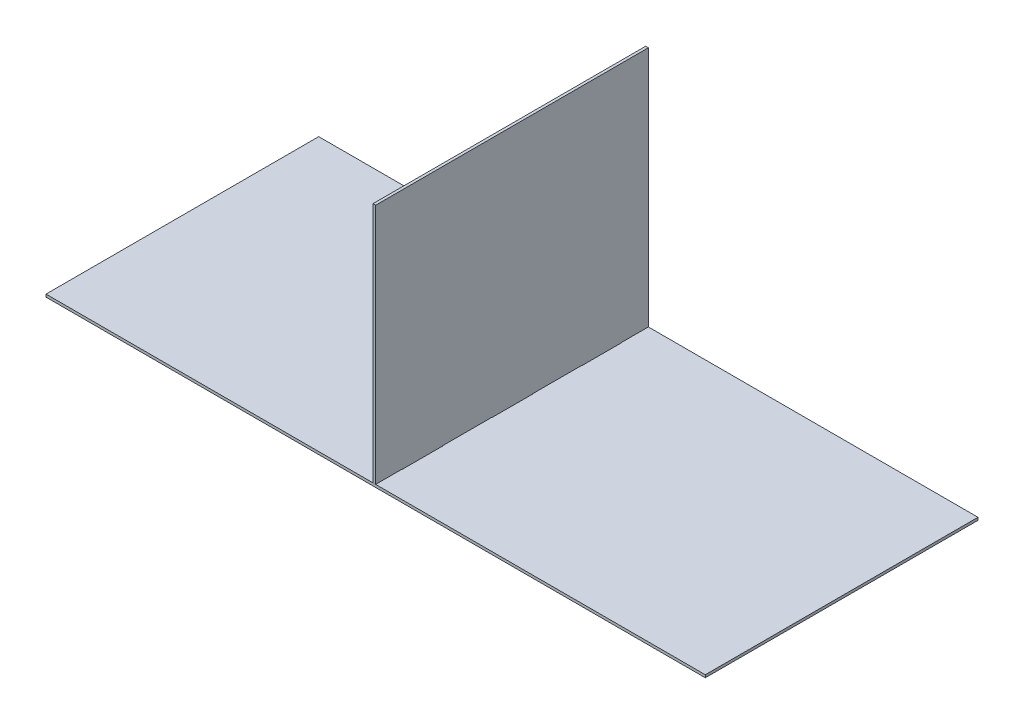
ISO-10303-21;
HEADER;
FILE_DESCRIPTION(('STEP AP214'),'2;1');
FILE_NAME('part.step','',(''),(''),'','','');
FILE_SCHEMA(('AUTOMOTIVE_DESIGN { 1 0 10303 214 1 1 1 1 }'));
ENDSEC;
DATA;
#1=APPLICATION_CONTEXT('core data for automotive mechanical design processes');
#2=APPLICATION_PROTOCOL_DEFINITION('international standard','automotive_design',2000,#1);
#3=PRODUCT_CONTEXT('',#1,'mechanical');
#4=PRODUCT('Part','Part','',(#3));
#5=PRODUCT_RELATED_PRODUCT_CATEGORY('part','',(#4));
#6=PRODUCT_DEFINITION_FORMATION('','',#4);
#7=PRODUCT_DEFINITION_CONTEXT('part definition',#1,'design');
#8=PRODUCT_DEFINITION('design','',#6,#7);
#9=PRODUCT_DEFINITION_SHAPE('','',#8);
#10=(LENGTH_UNIT() NAMED_UNIT(*) SI_UNIT(.MILLI.,.METRE.));
#11=(NAMED_UNIT(*) PLANE_ANGLE_UNIT() SI_UNIT($,.RADIAN.));
#12=(NAMED_UNIT(*) SI_UNIT($,.STERADIAN.) SOLID_ANGLE_UNIT());
#13=UNCERTAINTY_MEASURE_WITH_UNIT(LENGTH_MEASURE(1.E-05),#10,'distance_accuracy_value','');
#14=(GEOMETRIC_REPRESENTATION_CONTEXT(3) GLOBAL_UNCERTAINTY_ASSIGNED_CONTEXT((#13)) GLOBAL_UNIT_ASSIGNED_CONTEXT((#10,
#11,#12)) REPRESENTATION_CONTEXT('',''));
#15=CARTESIAN_POINT('',(0.,0.,0.));
#16=DIRECTION('',(0.,0.,1.));
#17=DIRECTION('',(1.,0.,0.));
#18=AXIS2_PLACEMENT_3D('',#15,#16,#17);
#19=CARTESIAN_POINT('',(-1.,0.,51.1200103284297));
#20=DIRECTION('',(0.,-1.,0.));
#21=DIRECTION('',(0.,0.,-1.));
#22=AXIS2_PLACEMENT_3D('',#19,#20,#21);
#23=PLANE('',#22);
#24=CARTESIAN_POINT('',(0.,0.,-26.1200103284297));
#25=CARTESIAN_POINT('',(-1.,0.,-26.1200103284297));
#26=B_SPLINE_CURVE_WITH_KNOTS('',1,(#24,#25),.UNSPECIFIED.,.F.,.F.,(2,2),(0.,0.03125),.UNSPECIFIED.);
#27=CARTESIAN_POINT('',(0.,0.,-26.1200103284297));
#28=VERTEX_POINT('',#27);
#29=CARTESIAN_POINT('',(-1.,0.,-26.1200103284297));
#30=VERTEX_POINT('',#29);
#31=EDGE_CURVE('E221',#28,#30,#26,.T.);
#32=ORIENTED_EDGE('',*,*,#31,.F.);
#33=DIRECTION('',(0.,0.,-1.));
#34=VECTOR('',#33,1.);
#35=CARTESIAN_POINT('',(0.,0.,51.1200103284297));
#36=LINE('',#35,#34);
#37=CARTESIAN_POINT('',(0.,0.,-7.49999999999999));
#38=VERTEX_POINT('',#37);
#39=EDGE_CURVE('E203',#38,#28,#36,.T.);
#40=ORIENTED_EDGE('',*,*,#39,.F.);
#41=CARTESIAN_POINT('',(-1.,0.,-7.49999999999999));
#42=CARTESIAN_POINT('',(0.,0.,-7.49999999999999));
#43=B_SPLINE_CURVE_WITH_KNOTS('',1,(#41,#42),.UNSPECIFIED.,.F.,.F.,(2,2),(0.5,0.53125),.UNSPECIFIED.);
#44=CARTESIAN_POINT('',(-1.,0.,-7.49999999999997));
#45=VERTEX_POINT('',#44);
#46=EDGE_CURVE('E257',#45,#38,#43,.T.);
#47=ORIENTED_EDGE('',*,*,#46,.F.);
#48=DIRECTION('',(0.,0.,-1.));
#49=VECTOR('',#48,1.);
#50=CARTESIAN_POINT('',(-1.,0.,51.1200103284297));
#51=LINE('',#50,#49);
#52=EDGE_CURVE('E109',#45,#30,#51,.T.);
#53=ORIENTED_EDGE('',*,*,#52,.T.);
#54=EDGE_LOOP('',(#32,#40,#47,#53));
#55=FACE_BOUND('',#54,.T.);
#56=ADVANCED_FACE('F84',(#55),#23,.T.);
#57=CARTESIAN_POINT('',(0.,0.,7.50000000000001));
#58=CARTESIAN_POINT('',(-1.,0.,7.50000000000001));
#59=B_SPLINE_CURVE_WITH_KNOTS('',1,(#57,#58),.UNSPECIFIED.,.F.,.F.,(2,2),(0.,0.03125),.UNSPECIFIED.);
#60=CARTESIAN_POINT('',(0.,0.,7.50000000000003));
#61=VERTEX_POINT('',#60);
#62=CARTESIAN_POINT('',(-1.,0.,7.50000000000003));
#63=VERTEX_POINT('',#62);
#64=EDGE_CURVE('E252',#61,#63,#59,.T.);
#65=ORIENTED_EDGE('',*,*,#64,.F.);
#66=CARTESIAN_POINT('',(0.,0.,26.1200103284297));
#67=VERTEX_POINT('',#66);
#68=EDGE_CURVE('E342',#67,#61,#36,.T.);
#69=ORIENTED_EDGE('',*,*,#68,.F.);
#70=CARTESIAN_POINT('',(-1.,0.,26.1200103284297));
#71=CARTESIAN_POINT('',(0.,0.,26.1200103284297));
#72=B_SPLINE_CURVE_WITH_KNOTS('',1,(#70,#71),.UNSPECIFIED.,.F.,.F.,(2,2),(0.5,0.53125),.UNSPECIFIED.);
#73=CARTESIAN_POINT('',(-1.,0.,26.1200103284297));
#74=VERTEX_POINT('',#73);
#75=EDGE_CURVE('E298',#74,#67,#72,.T.);
#76=ORIENTED_EDGE('',*,*,#75,.F.);
#77=EDGE_CURVE('E335',#74,#63,#51,.T.);
#78=ORIENTED_EDGE('',*,*,#77,.T.);
#79=EDGE_LOOP('',(#65,#69,#76,#78));
#80=FACE_BOUND('',#79,.T.);
#81=ADVANCED_FACE('F370',(#80),#23,.T.);
#82=CARTESIAN_POINT('',(0.,0.,41.1200103284297));
#83=CARTESIAN_POINT('',(-1.,0.,41.1200103284297));
#84=B_SPLINE_CURVE_WITH_KNOTS('',1,(#82,#83),.UNSPECIFIED.,.F.,.F.,(2,2),(0.,0.03125),.UNSPECIFIED.);
#85=CARTESIAN_POINT('',(0.,0.,41.1200103284297));
#86=VERTEX_POINT('',#85);
#87=CARTESIAN_POINT('',(-1.,0.,41.1200103284297));
#88=VERTEX_POINT('',#87);
#89=EDGE_CURVE('E251',#86,#88,#84,.T.);
#90=ORIENTED_EDGE('',*,*,#89,.F.);
#91=CARTESIAN_POINT('',(0.,0.,51.1200103284297));
#92=VERTEX_POINT('',#91);
#93=EDGE_CURVE('E206',#92,#86,#36,.T.);
#94=ORIENTED_EDGE('',*,*,#93,.F.);
#95=DIRECTION('',(1.,0.,0.));
#96=VECTOR('',#95,1.);
#97=CARTESIAN_POINT('',(-1.,0.,51.1200103284297));
#98=LINE('',#97,#96);
#99=CARTESIAN_POINT('',(-1.,0.,51.1200103284297));
#100=VERTEX_POINT('',#99);
#101=EDGE_CURVE('E93',#100,#92,#98,.T.);
#102=ORIENTED_EDGE('',*,*,#101,.F.);
#103=EDGE_CURVE('E333',#100,#88,#51,.T.);
#104=ORIENTED_EDGE('',*,*,#103,.T.);
#105=EDGE_LOOP('',(#90,#94,#102,#104));
#106=FACE_BOUND('',#105,.T.);
#107=ADVANCED_FACE('F356',(#106),#23,.T.);
#108=CARTESIAN_POINT('',(-1.,90.6545936345241,-51.1200103284297));
#109=DIRECTION('',(0.,0.,-1.));
#110=DIRECTION('',(-1.,0.,0.));
#111=AXIS2_PLACEMENT_3D('',#108,#109,#110);
#112=PLANE('',#111);
#113=DIRECTION('',(0.,1.,0.));
#114=VECTOR('',#113,1.);
#115=CARTESIAN_POINT('',(0.,90.6545936345241,-51.1200103284297));
#116=LINE('',#115,#114);
#117=CARTESIAN_POINT('',(0.,0.,-51.1200103284297));
#118=VERTEX_POINT('',#117);
#119=CARTESIAN_POINT('',(0.,90.6545936345241,-51.1200103284297));
#120=VERTEX_POINT('',#119);
#121=EDGE_CURVE('E293',#118,#120,#116,.T.);
#122=ORIENTED_EDGE('',*,*,#121,.F.);
#123=DIRECTION('',(1.,0.,0.));
#124=VECTOR('',#123,1.);
#125=CARTESIAN_POINT('',(-1.,0.,-51.1200103284297));
#126=LINE('',#125,#124);
#127=CARTESIAN_POINT('',(-1.,0.,-51.1200103284297));
#128=VERTEX_POINT('',#127);
#129=EDGE_CURVE('E14',#128,#118,#126,.T.);
#130=ORIENTED_EDGE('',*,*,#129,.F.);
#131=DIRECTION('',(0.,1.,0.));
#132=VECTOR('',#131,1.);
#133=CARTESIAN_POINT('',(-1.,90.6545936345241,-51.1200103284297));
#134=LINE('',#133,#132);
#135=CARTESIAN_POINT('',(-1.,90.6545936345241,-51.1200103284297));
#136=VERTEX_POINT('',#135);
#137=EDGE_CURVE('E323',#128,#136,#134,.T.);
#138=ORIENTED_EDGE('',*,*,#137,.T.);
#139=DIRECTION('',(1.,0.,0.));
#140=VECTOR('',#139,1.);
#141=CARTESIAN_POINT('',(-1.,90.6545936345241,-51.1200103284297));
#142=LINE('',#141,#140);
#143=EDGE_CURVE('E88',#136,#120,#142,.T.);
#144=ORIENTED_EDGE('',*,*,#143,.T.);
#145=EDGE_LOOP('',(#122,#130,#138,#144));
#146=FACE_BOUND('',#145,.T.);
#147=ADVANCED_FACE('F86',(#146),#112,.T.);
#148=CARTESIAN_POINT('',(-1.,0.,-41.1200103284297));
#149=CARTESIAN_POINT('',(0.,0.,-41.1200103284297));
#150=B_SPLINE_CURVE_WITH_KNOTS('',1,(#148,#149),.UNSPECIFIED.,.F.,.F.,(2,2),(0.5,0.53125),.UNSPECIFIED.);
#151=CARTESIAN_POINT('',(-1.,0.,-41.1200103284297));
#152=VERTEX_POINT('',#151);
#153=CARTESIAN_POINT('',(0.,0.,-41.1200103284297));
#154=VERTEX_POINT('',#153);
#155=EDGE_CURVE('E101',#152,#154,#150,.T.);
#156=ORIENTED_EDGE('',*,*,#155,.F.);
#157=EDGE_CURVE('E332',#152,#128,#51,.T.);
#158=ORIENTED_EDGE('',*,*,#157,.T.);
#159=ORIENTED_EDGE('',*,*,#129,.T.);
#160=EDGE_CURVE('E196',#154,#118,#36,.T.);
#161=ORIENTED_EDGE('',*,*,#160,.F.);
#162=EDGE_LOOP('',(#156,#158,#159,#161));
#163=FACE_BOUND('',#162,.T.);
#164=ADVANCED_FACE('F198',(#163),#23,.T.);
#165=CARTESIAN_POINT('',(-1.,90.6545936345241,51.1200103284297));
#166=DIRECTION('',(0.,0.,1.));
#167=DIRECTION('',(0.,-1.,0.));
#168=AXIS2_PLACEMENT_3D('',#165,#166,#167);
#169=PLANE('',#168);
#170=DIRECTION('',(0.,-1.,0.));
#171=VECTOR('',#170,1.);
#172=CARTESIAN_POINT('',(0.,90.6545936345241,51.1200103284297));
#173=LINE('',#172,#171);
#174=CARTESIAN_POINT('',(0.,90.6545936345241,51.1200103284297));
#175=VERTEX_POINT('',#174);
#176=EDGE_CURVE('E204',#175,#92,#173,.T.);
#177=ORIENTED_EDGE('',*,*,#176,.F.);
#178=DIRECTION('',(1.,0.,0.));
#179=VECTOR('',#178,1.);
#180=CARTESIAN_POINT('',(-1.,90.6545936345241,51.1200103284297));
#181=LINE('',#180,#179);
#182=CARTESIAN_POINT('',(-1.,90.6545936345241,51.1200103284297));
#183=VERTEX_POINT('',#182);
#184=EDGE_CURVE('E344',#183,#175,#181,.T.);
#185=ORIENTED_EDGE('',*,*,#184,.F.);
#186=DIRECTION('',(0.,-1.,0.));
#187=VECTOR('',#186,1.);
#188=CARTESIAN_POINT('',(-1.,90.6545936345241,51.1200103284297));
#189=LINE('',#188,#187);
#190=EDGE_CURVE('E329',#183,#100,#189,.T.);
#191=ORIENTED_EDGE('',*,*,#190,.T.);
#192=ORIENTED_EDGE('',*,*,#101,.T.);
#193=EDGE_LOOP('',(#177,#185,#191,#192));
#194=FACE_BOUND('',#193,.T.);
#195=ADVANCED_FACE('F375',(#194),#169,.T.);
#196=CARTESIAN_POINT('',(-1.,90.6545936345241,51.1200103284297));
#197=DIRECTION('',(0.,1.,0.));
#198=DIRECTION('',(0.,0.,1.));
#199=AXIS2_PLACEMENT_3D('',#196,#197,#198);
#200=PLANE('',#199);
#201=DIRECTION('',(0.,0.,1.));
#202=VECTOR('',#201,1.);
#203=CARTESIAN_POINT('',(0.,90.6545936345241,51.1200103284297));
#204=LINE('',#203,#202);
#205=EDGE_CURVE('E337',#120,#175,#204,.T.);
#206=ORIENTED_EDGE('',*,*,#205,.F.);
#207=ORIENTED_EDGE('',*,*,#143,.F.);
#208=DIRECTION('',(0.,0.,1.));
#209=VECTOR('',#208,1.);
#210=CARTESIAN_POINT('',(-1.,90.6545936345241,51.1200103284297));
#211=LINE('',#210,#209);
#212=EDGE_CURVE('E326',#136,#183,#211,.T.);
#213=ORIENTED_EDGE('',*,*,#212,.T.);
#214=ORIENTED_EDGE('',*,*,#184,.T.);
#215=EDGE_LOOP('',(#206,#207,#213,#214));
#216=FACE_BOUND('',#215,.T.);
#217=ADVANCED_FACE('F351',(#216),#200,.T.);
#218=CARTESIAN_POINT('',(-1.,0.,0.));
#219=DIRECTION('',(1.,0.,0.));
#220=DIRECTION('',(0.,0.,-1.));
#221=AXIS2_PLACEMENT_3D('',#218,#219,#220);
#222=PLANE('',#221);
#223=ORIENTED_EDGE('',*,*,#137,.F.);
#224=ORIENTED_EDGE('',*,*,#157,.F.);
#225=DIRECTION('',(0.,1.,0.));
#226=VECTOR('',#225,1.);
#227=CARTESIAN_POINT('',(-1.,-2.,-41.1200103284297));
#228=LINE('',#227,#226);
#229=CARTESIAN_POINT('',(-1.,-1.,-41.1200103284297));
#230=VERTEX_POINT('',#229);
#231=EDGE_CURVE('E215',#230,#152,#228,.T.);
#232=ORIENTED_EDGE('',*,*,#231,.F.);
#233=DIRECTION('',(0.,0.,1.));
#234=VECTOR('',#233,1.);
#235=CARTESIAN_POINT('',(-1.,-1.,-26.1200103284297));
#236=LINE('',#235,#234);
#237=CARTESIAN_POINT('',(-1.,-1.,-26.1200103284297));
#238=VERTEX_POINT('',#237);
#239=EDGE_CURVE('E422',#230,#238,#236,.T.);
#240=ORIENTED_EDGE('',*,*,#239,.T.);
#241=DIRECTION('',(0.,1.,0.));
#242=VECTOR('',#241,1.);
#243=CARTESIAN_POINT('',(-1.,-2.,-26.1200103284297));
#244=LINE('',#243,#242);
#245=EDGE_CURVE('E237',#238,#30,#244,.T.);
#246=ORIENTED_EDGE('',*,*,#245,.T.);
#247=ORIENTED_EDGE('',*,*,#52,.F.);
#248=DIRECTION('',(0.,1.,0.));
#249=VECTOR('',#248,1.);
#250=CARTESIAN_POINT('',(-1.,-2.,-7.49999999999999));
#251=LINE('',#250,#249);
#252=CARTESIAN_POINT('',(-1.,-1.,-7.49999999999999));
#253=VERTEX_POINT('',#252);
#254=EDGE_CURVE('E275',#253,#45,#251,.T.);
#255=ORIENTED_EDGE('',*,*,#254,.F.);
#256=DIRECTION('',(0.,0.,1.));
#257=VECTOR('',#256,1.);
#258=CARTESIAN_POINT('',(-1.,-1.,7.50000000000001));
#259=LINE('',#258,#257);
#260=CARTESIAN_POINT('',(-1.,-1.,7.50000000000001));
#261=VERTEX_POINT('',#260);
#262=EDGE_CURVE('E244',#253,#261,#259,.T.);
#263=ORIENTED_EDGE('',*,*,#262,.T.);
#264=DIRECTION('',(0.,1.,0.));
#265=VECTOR('',#264,1.);
#266=CARTESIAN_POINT('',(-1.,-2.,7.50000000000001));
#267=LINE('',#266,#265);
#268=EDGE_CURVE('E278',#261,#63,#267,.T.);
#269=ORIENTED_EDGE('',*,*,#268,.T.);
#270=ORIENTED_EDGE('',*,*,#77,.F.);
#271=DIRECTION('',(0.,1.,0.));
#272=VECTOR('',#271,1.);
#273=CARTESIAN_POINT('',(-1.,-2.,26.1200103284297));
#274=LINE('',#273,#272);
#275=CARTESIAN_POINT('',(-1.,-1.,26.1200103284297));
#276=VERTEX_POINT('',#275);
#277=EDGE_CURVE('E315',#276,#74,#274,.T.);
#278=ORIENTED_EDGE('',*,*,#277,.F.);
#279=DIRECTION('',(0.,0.,1.));
#280=VECTOR('',#279,1.);
#281=CARTESIAN_POINT('',(-1.,-1.,41.1200103284297));
#282=LINE('',#281,#280);
#283=CARTESIAN_POINT('',(-1.,-1.,41.1200103284297));
#284=VERTEX_POINT('',#283);
#285=EDGE_CURVE('E286',#276,#284,#282,.T.);
#286=ORIENTED_EDGE('',*,*,#285,.T.);
#287=DIRECTION('',(0.,1.,0.));
#288=VECTOR('',#287,1.);
#289=CARTESIAN_POINT('',(-1.,-2.,41.1200103284297));
#290=LINE('',#289,#288);
#291=EDGE_CURVE('E318',#284,#88,#290,.T.);
#292=ORIENTED_EDGE('',*,*,#291,.T.);
#293=ORIENTED_EDGE('',*,*,#103,.F.);
#294=ORIENTED_EDGE('',*,*,#190,.F.);
#295=ORIENTED_EDGE('',*,*,#212,.F.);
#296=EDGE_LOOP('',(#223,#224,#232,#240,#246,#247,#255,#263,#269,#270,#278,#286,#292,#293,#294,#295));
#297=FACE_BOUND('',#296,.T.);
#298=ADVANCED_FACE('F372',(#297),#222,.F.);
#299=CARTESIAN_POINT('',(0.,0.,0.));
#300=DIRECTION('',(1.,0.,0.));
#301=DIRECTION('',(0.,0.,-1.));
#302=AXIS2_PLACEMENT_3D('',#299,#300,#301);
#303=PLANE('',#302);
#304=ORIENTED_EDGE('',*,*,#121,.T.);
#305=ORIENTED_EDGE('',*,*,#205,.T.);
#306=ORIENTED_EDGE('',*,*,#176,.T.);
#307=ORIENTED_EDGE('',*,*,#93,.T.);
#308=DIRECTION('',(0.,1.,0.));
#309=VECTOR('',#308,1.);
#310=CARTESIAN_POINT('',(0.,-2.,41.1200103284297));
#311=LINE('',#310,#309);
#312=CARTESIAN_POINT('',(0.,-1.,41.1200103284297));
#313=VERTEX_POINT('',#312);
#314=EDGE_CURVE('E306',#313,#86,#311,.T.);
#315=ORIENTED_EDGE('',*,*,#314,.F.);
#316=DIRECTION('',(0.,0.,-1.));
#317=VECTOR('',#316,1.);
#318=CARTESIAN_POINT('',(0.,-1.,26.1200103284297));
#319=LINE('',#318,#317);
#320=CARTESIAN_POINT('',(0.,-1.,26.1200103284297));
#321=VERTEX_POINT('',#320);
#322=EDGE_CURVE('E287',#313,#321,#319,.T.);
#323=ORIENTED_EDGE('',*,*,#322,.T.);
#324=DIRECTION('',(0.,1.,0.));
#325=VECTOR('',#324,1.);
#326=CARTESIAN_POINT('',(0.,-2.,26.1200103284297));
#327=LINE('',#326,#325);
#328=EDGE_CURVE('E312',#321,#67,#327,.T.);
#329=ORIENTED_EDGE('',*,*,#328,.T.);
#330=ORIENTED_EDGE('',*,*,#68,.T.);
#331=DIRECTION('',(0.,1.,0.));
#332=VECTOR('',#331,1.);
#333=CARTESIAN_POINT('',(0.,-2.,7.50000000000001));
#334=LINE('',#333,#332);
#335=CARTESIAN_POINT('',(0.,-1.,7.50000000000001));
#336=VERTEX_POINT('',#335);
#337=EDGE_CURVE('E266',#336,#61,#334,.T.);
#338=ORIENTED_EDGE('',*,*,#337,.F.);
#339=DIRECTION('',(0.,0.,-1.));
#340=VECTOR('',#339,1.);
#341=CARTESIAN_POINT('',(0.,-1.,-7.49999999999999));
#342=LINE('',#341,#340);
#343=CARTESIAN_POINT('',(0.,-1.,-7.49999999999999));
#344=VERTEX_POINT('',#343);
#345=EDGE_CURVE('E245',#336,#344,#342,.T.);
#346=ORIENTED_EDGE('',*,*,#345,.T.);
#347=DIRECTION('',(0.,1.,0.));
#348=VECTOR('',#347,1.);
#349=CARTESIAN_POINT('',(0.,-2.,-7.49999999999999));
#350=LINE('',#349,#348);
#351=EDGE_CURVE('E272',#344,#38,#350,.T.);
#352=ORIENTED_EDGE('',*,*,#351,.T.);
#353=ORIENTED_EDGE('',*,*,#39,.T.);
#354=DIRECTION('',(0.,1.,0.));
#355=VECTOR('',#354,1.);
#356=CARTESIAN_POINT('',(0.,-2.,-26.1200103284297));
#357=LINE('',#356,#355);
#358=CARTESIAN_POINT('',(0.,-1.,-26.1200103284297));
#359=VERTEX_POINT('',#358);
#360=EDGE_CURVE('E216',#359,#28,#357,.T.);
#361=ORIENTED_EDGE('',*,*,#360,.F.);
#362=DIRECTION('',(0.,0.,-1.));
#363=VECTOR('',#362,1.);
#364=CARTESIAN_POINT('',(0.,-1.,-41.1200103284297));
#365=LINE('',#364,#363);
#366=CARTESIAN_POINT('',(0.,-1.,-41.1200103284297));
#367=VERTEX_POINT('',#366);
#368=EDGE_CURVE('E212',#359,#367,#365,.T.);
#369=ORIENTED_EDGE('',*,*,#368,.T.);
#370=DIRECTION('',(0.,1.,0.));
#371=VECTOR('',#370,1.);
#372=CARTESIAN_POINT('',(0.,-2.,-41.1200103284297));
#373=LINE('',#372,#371);
#374=EDGE_CURVE('E209',#367,#154,#373,.T.);
#375=ORIENTED_EDGE('',*,*,#374,.T.);
#376=ORIENTED_EDGE('',*,*,#160,.T.);
#377=EDGE_LOOP('',(#304,#305,#306,#307,#315,#323,#329,#330,#338,#346,#352,#353,#361,#369,#375,#376));
#378=FACE_BOUND('',#377,.T.);
#379=ADVANCED_FACE('F210',(#378),#303,.T.);
#380=CARTESIAN_POINT('',(-1.,-2.,26.1200103284297));
#381=DIRECTION('',(0.,0.,1.));
#382=DIRECTION('',(1.,0.,0.));
#383=AXIS2_PLACEMENT_3D('',#380,#381,#382);
#384=PLANE('',#383);
#385=ORIENTED_EDGE('',*,*,#328,.F.);
#386=DIRECTION('',(-1.,0.,0.));
#387=VECTOR('',#386,1.);
#388=CARTESIAN_POINT('',(-1.,-1.,26.1200103284297));
#389=LINE('',#388,#387);
#390=EDGE_CURVE('E283',#321,#276,#389,.T.);
#391=ORIENTED_EDGE('',*,*,#390,.T.);
#392=ORIENTED_EDGE('',*,*,#277,.T.);
#393=ORIENTED_EDGE('',*,*,#75,.T.);
#394=EDGE_LOOP('',(#385,#391,#392,#393));
#395=FACE_BOUND('',#394,.T.);
#396=ADVANCED_FACE('F367',(#395),#384,.F.);
#397=CARTESIAN_POINT('',(0.,-2.,41.1200103284297));
#398=DIRECTION('',(0.,0.,-1.));
#399=DIRECTION('',(-1.,0.,0.));
#400=AXIS2_PLACEMENT_3D('',#397,#398,#399);
#401=PLANE('',#400);
#402=ORIENTED_EDGE('',*,*,#291,.F.);
#403=DIRECTION('',(1.,0.,0.));
#404=VECTOR('',#403,1.);
#405=CARTESIAN_POINT('',(0.,-1.,41.1200103284297));
#406=LINE('',#405,#404);
#407=EDGE_CURVE('E290',#284,#313,#406,.T.);
#408=ORIENTED_EDGE('',*,*,#407,.T.);
#409=ORIENTED_EDGE('',*,*,#314,.T.);
#410=ORIENTED_EDGE('',*,*,#89,.T.);
#411=EDGE_LOOP('',(#402,#408,#409,#410));
#412=FACE_BOUND('',#411,.T.);
#413=ADVANCED_FACE('F360',(#412),#401,.F.);
#414=CARTESIAN_POINT('',(0.,-1.,0.));
#415=DIRECTION('',(0.,1.,0.));
#416=DIRECTION('',(0.,0.,1.));
#417=AXIS2_PLACEMENT_3D('',#414,#415,#416);
#418=PLANE('',#417);
#419=ORIENTED_EDGE('',*,*,#285,.F.);
#420=ORIENTED_EDGE('',*,*,#390,.F.);
#421=ORIENTED_EDGE('',*,*,#322,.F.);
#422=ORIENTED_EDGE('',*,*,#407,.F.);
#423=EDGE_LOOP('',(#419,#420,#421,#422));
#424=FACE_BOUND('',#423,.T.);
#425=ADVANCED_FACE('F364',(#424),#418,.F.);
#426=CARTESIAN_POINT('',(-1.,-2.,-7.49999999999999));
#427=DIRECTION('',(0.,0.,1.));
#428=DIRECTION('',(1.,0.,0.));
#429=AXIS2_PLACEMENT_3D('',#426,#427,#428);
#430=PLANE('',#429);
#431=ORIENTED_EDGE('',*,*,#351,.F.);
#432=DIRECTION('',(-1.,0.,0.));
#433=VECTOR('',#432,1.);
#434=CARTESIAN_POINT('',(-1.,-1.,-7.49999999999999));
#435=LINE('',#434,#433);
#436=EDGE_CURVE('E241',#344,#253,#435,.T.);
#437=ORIENTED_EDGE('',*,*,#436,.T.);
#438=ORIENTED_EDGE('',*,*,#254,.T.);
#439=ORIENTED_EDGE('',*,*,#46,.T.);
#440=EDGE_LOOP('',(#431,#437,#438,#439));
#441=FACE_BOUND('',#440,.T.);
#442=ADVANCED_FACE('F398',(#441),#430,.F.);
#443=CARTESIAN_POINT('',(0.,-2.,7.50000000000001));
#444=DIRECTION('',(0.,0.,-1.));
#445=DIRECTION('',(-1.,0.,0.));
#446=AXIS2_PLACEMENT_3D('',#443,#444,#445);
#447=PLANE('',#446);
#448=ORIENTED_EDGE('',*,*,#268,.F.);
#449=DIRECTION('',(1.,0.,0.));
#450=VECTOR('',#449,1.);
#451=CARTESIAN_POINT('',(0.,-1.,7.50000000000001));
#452=LINE('',#451,#450);
#453=EDGE_CURVE('E248',#261,#336,#452,.T.);
#454=ORIENTED_EDGE('',*,*,#453,.T.);
#455=ORIENTED_EDGE('',*,*,#337,.T.);
#456=ORIENTED_EDGE('',*,*,#64,.T.);
#457=EDGE_LOOP('',(#448,#454,#455,#456));
#458=FACE_BOUND('',#457,.T.);
#459=ADVANCED_FACE('F399',(#458),#447,.F.);
#460=CARTESIAN_POINT('',(0.,-1.,0.));
#461=DIRECTION('',(0.,1.,0.));
#462=DIRECTION('',(0.,0.,1.));
#463=AXIS2_PLACEMENT_3D('',#460,#461,#462);
#464=PLANE('',#463);
#465=ORIENTED_EDGE('',*,*,#262,.F.);
#466=ORIENTED_EDGE('',*,*,#436,.F.);
#467=ORIENTED_EDGE('',*,*,#345,.F.);
#468=ORIENTED_EDGE('',*,*,#453,.F.);
#469=EDGE_LOOP('',(#465,#466,#467,#468));
#470=FACE_BOUND('',#469,.T.);
#471=ADVANCED_FACE('F402',(#470),#464,.F.);
#472=CARTESIAN_POINT('',(-1.,-2.,-41.1200103284297));
#473=DIRECTION('',(0.,0.,1.));
#474=DIRECTION('',(1.,0.,0.));
#475=AXIS2_PLACEMENT_3D('',#472,#473,#474);
#476=PLANE('',#475);
#477=ORIENTED_EDGE('',*,*,#374,.F.);
#478=DIRECTION('',(-1.,0.,0.));
#479=VECTOR('',#478,1.);
#480=CARTESIAN_POINT('',(-1.,-1.,-41.1200103284297));
#481=LINE('',#480,#479);
#482=EDGE_CURVE('E240',#367,#230,#481,.T.);
#483=ORIENTED_EDGE('',*,*,#482,.T.);
#484=ORIENTED_EDGE('',*,*,#231,.T.);
#485=ORIENTED_EDGE('',*,*,#155,.T.);
#486=EDGE_LOOP('',(#477,#483,#484,#485));
#487=FACE_BOUND('',#486,.T.);
#488=ADVANCED_FACE('F219',(#487),#476,.F.);
#489=CARTESIAN_POINT('',(0.,-2.,-26.1200103284297));
#490=DIRECTION('',(0.,0.,-1.));
#491=DIRECTION('',(-1.,0.,0.));
#492=AXIS2_PLACEMENT_3D('',#489,#490,#491);
#493=PLANE('',#492);
#494=ORIENTED_EDGE('',*,*,#245,.F.);
#495=DIRECTION('',(1.,0.,0.));
#496=VECTOR('',#495,1.);
#497=CARTESIAN_POINT('',(0.,-1.,-26.1200103284297));
#498=LINE('',#497,#496);
#499=EDGE_CURVE('E258',#238,#359,#498,.T.);
#500=ORIENTED_EDGE('',*,*,#499,.T.);
#501=ORIENTED_EDGE('',*,*,#360,.T.);
#502=ORIENTED_EDGE('',*,*,#31,.T.);
#503=EDGE_LOOP('',(#494,#500,#501,#502));
#504=FACE_BOUND('',#503,.T.);
#505=ADVANCED_FACE('F410',(#504),#493,.F.);
#506=CARTESIAN_POINT('',(0.,-1.,0.));
#507=DIRECTION('',(0.,1.,0.));
#508=DIRECTION('',(0.,0.,1.));
#509=AXIS2_PLACEMENT_3D('',#506,#507,#508);
#510=PLANE('',#509);
#511=ORIENTED_EDGE('',*,*,#239,.F.);
#512=ORIENTED_EDGE('',*,*,#482,.F.);
#513=ORIENTED_EDGE('',*,*,#368,.F.);
#514=ORIENTED_EDGE('',*,*,#499,.F.);
#515=EDGE_LOOP('',(#511,#512,#513,#514));
#516=FACE_BOUND('',#515,.T.);
#517=ADVANCED_FACE('F413',(#516),#510,.F.);
#518=CLOSED_SHELL('',(#56,#81,#107,#147,#164,#195,#217,#298,#379,#396,#413,#425,#442,#459,#471,
#488,#505,#517));
#519=MANIFOLD_SOLID_BREP('B2',#518);
#520=CARTESIAN_POINT('',(0.,-1.,0.));
#521=DIRECTION('',(0.,1.,0.));
#522=DIRECTION('',(0.,0.,1.));
#523=AXIS2_PLACEMENT_3D('',#520,#521,#522);
#524=PLANE('',#523);
#525=DIRECTION('',(0.,0.,-1.));
#526=VECTOR('',#525,1.);
#527=CARTESIAN_POINT('',(0.1,-1.,-7.59999999999998));
#528=LINE('',#527,#526);
#529=CARTESIAN_POINT('',(0.1,-1.,7.60000000000002));
#530=VERTEX_POINT('',#529);
#531=CARTESIAN_POINT('',(0.1,-1.,-7.59999999999998));
#532=VERTEX_POINT('',#531);
#533=EDGE_CURVE('E802',#530,#532,#528,.T.);
#534=ORIENTED_EDGE('',*,*,#533,.T.);
#535=DIRECTION('',(-1.,0.,0.));
#536=VECTOR('',#535,1.);
#537=CARTESIAN_POINT('',(-1.1,-1.,-7.59999999999998));
#538=LINE('',#537,#536);
#539=CARTESIAN_POINT('',(-1.1,-1.,-7.59999999999998));
#540=VERTEX_POINT('',#539);
#541=EDGE_CURVE('E797',#532,#540,#538,.T.);
#542=ORIENTED_EDGE('',*,*,#541,.T.);
#543=DIRECTION('',(0.,0.,1.));
#544=VECTOR('',#543,1.);
#545=CARTESIAN_POINT('',(-1.1,-1.,7.60000000000002));
#546=LINE('',#545,#544);
#547=CARTESIAN_POINT('',(-1.1,-1.,7.60000000000002));
#548=VERTEX_POINT('',#547);
#549=EDGE_CURVE('E801',#540,#548,#546,.T.);
#550=ORIENTED_EDGE('',*,*,#549,.T.);
#551=DIRECTION('',(1.,0.,0.));
#552=VECTOR('',#551,1.);
#553=CARTESIAN_POINT('',(0.1,-1.,7.60000000000002));
#554=LINE('',#553,#552);
#555=EDGE_CURVE('E763',#548,#530,#554,.T.);
#556=ORIENTED_EDGE('',*,*,#555,.T.);
#557=EDGE_LOOP('',(#534,#542,#550,#556));
#558=FACE_BOUND('',#557,.T.);
#559=DIRECTION('',(0.,0.,-1.));
#560=VECTOR('',#559,1.);
#561=CARTESIAN_POINT('',(123.586838156643,-1.,-51.1200103284297));
#562=LINE('',#561,#560);
#563=CARTESIAN_POINT('',(123.586838156643,-1.,51.1200103284297));
#564=VERTEX_POINT('',#563);
#565=CARTESIAN_POINT('',(123.586838156643,-1.,-51.1200103284297));
#566=VERTEX_POINT('',#565);
#567=EDGE_CURVE('E925',#564,#566,#562,.T.);
#568=ORIENTED_EDGE('',*,*,#567,.F.);
#569=DIRECTION('',(1.,0.,0.));
#570=VECTOR('',#569,1.);
#571=CARTESIAN_POINT('',(-123.586838156643,-1.,51.1200103284297));
#572=LINE('',#571,#570);
#573=CARTESIAN_POINT('',(-123.586838156643,-1.,51.1200103284297));
#574=VERTEX_POINT('',#573);
#575=EDGE_CURVE('E938',#574,#564,#572,.T.);
#576=ORIENTED_EDGE('',*,*,#575,.F.);
#577=DIRECTION('',(0.,0.,1.));
#578=VECTOR('',#577,1.);
#579=CARTESIAN_POINT('',(-123.586838156643,-1.,-51.1200103284297));
#580=LINE('',#579,#578);
#581=CARTESIAN_POINT('',(-123.586838156643,-1.,-51.1200103284297));
#582=VERTEX_POINT('',#581);
#583=EDGE_CURVE('E934',#582,#574,#580,.T.);
#584=ORIENTED_EDGE('',*,*,#583,.F.);
#585=DIRECTION('',(-1.,0.,0.));
#586=VECTOR('',#585,1.);
#587=CARTESIAN_POINT('',(-123.586838156643,-1.,-51.1200103284297));
#588=LINE('',#587,#586);
#589=EDGE_CURVE('E929',#566,#582,#588,.T.);
#590=ORIENTED_EDGE('',*,*,#589,.F.);
#591=EDGE_LOOP('',(#568,#576,#584,#590));
#592=FACE_BOUND('',#591,.T.);
#593=DIRECTION('',(0.,0.,-1.));
#594=VECTOR('',#593,1.);
#595=CARTESIAN_POINT('',(0.1,-1.,26.0200103284297));
#596=LINE('',#595,#594);
#597=CARTESIAN_POINT('',(0.1,-1.,41.2200103284297));
#598=VERTEX_POINT('',#597);
#599=CARTESIAN_POINT('',(0.1,-1.,26.0200103284297));
#600=VERTEX_POINT('',#599);
#601=EDGE_CURVE('E866',#598,#600,#596,.T.);
#602=ORIENTED_EDGE('',*,*,#601,.T.);
#603=DIRECTION('',(-1.,0.,0.));
#604=VECTOR('',#603,1.);
#605=CARTESIAN_POINT('',(-1.1,-1.,26.0200103284297));
#606=LINE('',#605,#604);
#607=CARTESIAN_POINT('',(-1.1,-1.,26.0200103284297));
#608=VERTEX_POINT('',#607);
#609=EDGE_CURVE('E861',#600,#608,#606,.T.);
#610=ORIENTED_EDGE('',*,*,#609,.T.);
#611=DIRECTION('',(0.,0.,1.));
#612=VECTOR('',#611,1.);
#613=CARTESIAN_POINT('',(-1.1,-1.,41.2200103284297));
#614=LINE('',#613,#612);
#615=CARTESIAN_POINT('',(-1.1,-1.,41.2200103284297));
#616=VERTEX_POINT('',#615);
#617=EDGE_CURVE('E865',#608,#616,#614,.T.);
#618=ORIENTED_EDGE('',*,*,#617,.T.);
#619=DIRECTION('',(1.,0.,0.));
#620=VECTOR('',#619,1.);
#621=CARTESIAN_POINT('',(0.1,-1.,41.2200103284297));
#622=LINE('',#621,#620);
#623=EDGE_CURVE('E816',#616,#598,#622,.T.);
#624=ORIENTED_EDGE('',*,*,#623,.T.);
#625=EDGE_LOOP('',(#602,#610,#618,#624));
#626=FACE_BOUND('',#625,.T.);
#627=DIRECTION('',(0.,0.,-1.));
#628=VECTOR('',#627,1.);
#629=CARTESIAN_POINT('',(0.1,-1.,-41.2200103284297));
#630=LINE('',#629,#628);
#631=CARTESIAN_POINT('',(0.1,-1.,-26.0200103284297));
#632=VERTEX_POINT('',#631);
#633=CARTESIAN_POINT('',(0.1,-1.,-41.2200103284297));
#634=VERTEX_POINT('',#633);
#635=EDGE_CURVE('E792',#632,#634,#630,.T.);
#636=ORIENTED_EDGE('',*,*,#635,.T.);
#637=DIRECTION('',(-1.,0.,0.));
#638=VECTOR('',#637,1.);
#639=CARTESIAN_POINT('',(-1.1,-1.,-41.2200103284297));
#640=LINE('',#639,#638);
#641=CARTESIAN_POINT('',(-1.1,-1.,-41.2200103284297));
#642=VERTEX_POINT('',#641);
#643=EDGE_CURVE('E796',#634,#642,#640,.T.);
#644=ORIENTED_EDGE('',*,*,#643,.T.);
#645=DIRECTION('',(0.,0.,1.));
#646=VECTOR('',#645,1.);
#647=CARTESIAN_POINT('',(-1.1,-1.,-26.0200103284297));
#648=LINE('',#647,#646);
#649=CARTESIAN_POINT('',(-1.1,-1.,-26.0200103284297));
#650=VERTEX_POINT('',#649);
#651=EDGE_CURVE('E740',#642,#650,#648,.T.);
#652=ORIENTED_EDGE('',*,*,#651,.T.);
#653=DIRECTION('',(1.,0.,0.));
#654=VECTOR('',#653,1.);
#655=CARTESIAN_POINT('',(0.1,-1.,-26.0200103284297));
#656=LINE('',#655,#654);
#657=EDGE_CURVE('E947',#650,#632,#656,.T.);
#658=ORIENTED_EDGE('',*,*,#657,.T.);
#659=EDGE_LOOP('',(#636,#644,#652,#658));
#660=FACE_BOUND('',#659,.T.);
#661=ADVANCED_FACE('F618',(#558,#592,#626,#660),#524,.F.);
#662=CARTESIAN_POINT('',(0.,0.,0.));
#663=DIRECTION('',(0.,1.,0.));
#664=DIRECTION('',(0.,0.,1.));
#665=AXIS2_PLACEMENT_3D('',#662,#663,#664);
#666=PLANE('',#665);
#667=DIRECTION('',(0.,0.,-1.));
#668=VECTOR('',#667,1.);
#669=CARTESIAN_POINT('',(123.586838156643,0.,-51.1200103284297));
#670=LINE('',#669,#668);
#671=CARTESIAN_POINT('',(123.586838156643,0.,51.1200103284297));
#672=VERTEX_POINT('',#671);
#673=CARTESIAN_POINT('',(123.586838156643,0.,-51.1200103284297));
#674=VERTEX_POINT('',#673);
#675=EDGE_CURVE('E942',#672,#674,#670,.T.);
#676=ORIENTED_EDGE('',*,*,#675,.T.);
#677=DIRECTION('',(-1.,0.,0.));
#678=VECTOR('',#677,1.);
#679=CARTESIAN_POINT('',(-123.586838156643,0.,-51.1200103284297));
#680=LINE('',#679,#678);
#681=CARTESIAN_POINT('',(-123.586838156643,0.,-51.1200103284297));
#682=VERTEX_POINT('',#681);
#683=EDGE_CURVE('E946',#674,#682,#680,.T.);
#684=ORIENTED_EDGE('',*,*,#683,.T.);
#685=DIRECTION('',(0.,0.,1.));
#686=VECTOR('',#685,1.);
#687=CARTESIAN_POINT('',(-123.586838156643,0.,-51.1200103284297));
#688=LINE('',#687,#686);
#689=CARTESIAN_POINT('',(-123.586838156643,0.,51.1200103284297));
#690=VERTEX_POINT('',#689);
#691=EDGE_CURVE('E951',#682,#690,#688,.T.);
#692=ORIENTED_EDGE('',*,*,#691,.T.);
#693=DIRECTION('',(1.,0.,0.));
#694=VECTOR('',#693,1.);
#695=CARTESIAN_POINT('',(-123.586838156643,0.,51.1200103284297));
#696=LINE('',#695,#694);
#697=EDGE_CURVE('E930',#690,#672,#696,.T.);
#698=ORIENTED_EDGE('',*,*,#697,.T.);
#699=EDGE_LOOP('',(#676,#684,#692,#698));
#700=FACE_BOUND('',#699,.T.);
#701=CARTESIAN_POINT('',(-1.1,0.,26.0200103284297));
#702=CARTESIAN_POINT('',(0.1,0.,26.0200103284297));
#703=B_SPLINE_CURVE_WITH_KNOTS('',1,(#701,#702),.UNSPECIFIED.,.F.,.F.,(2,2),(0.5,
0.536585365853659),.UNSPECIFIED.);
#704=CARTESIAN_POINT('',(-1.1,0.,26.0200103284297));
#705=VERTEX_POINT('',#704);
#706=CARTESIAN_POINT('',(0.1,0.,26.0200103284297));
#707=VERTEX_POINT('',#706);
#708=EDGE_CURVE('E888',#705,#707,#703,.T.);
#709=ORIENTED_EDGE('',*,*,#708,.T.);
#710=CARTESIAN_POINT('',(0.1,0.,26.0200103284297));
#711=CARTESIAN_POINT('',(0.1,0.,41.2200103284297));
#712=B_SPLINE_CURVE_WITH_KNOTS('',1,(#710,#711),.UNSPECIFIED.,.F.,.F.,(2,2),(0.536585365853659,
1.),.UNSPECIFIED.);
#713=CARTESIAN_POINT('',(0.1,0.,41.2200103284297));
#714=VERTEX_POINT('',#713);
#715=EDGE_CURVE('E897',#707,#714,#712,.T.);
#716=ORIENTED_EDGE('',*,*,#715,.T.);
#717=CARTESIAN_POINT('',(0.1,0.,41.2200103284297));
#718=CARTESIAN_POINT('',(-1.1,0.,41.2200103284297));
#719=B_SPLINE_CURVE_WITH_KNOTS('',1,(#717,#718),.UNSPECIFIED.,.F.,.F.,(2,2),(0.,
0.0365853658536585),.UNSPECIFIED.);
#720=CARTESIAN_POINT('',(-1.1,0.,41.2200103284297));
#721=VERTEX_POINT('',#720);
#722=EDGE_CURVE('E873',#714,#721,#719,.T.);
#723=ORIENTED_EDGE('',*,*,#722,.T.);
#724=CARTESIAN_POINT('',(-1.1,0.,41.2200103284297));
#725=CARTESIAN_POINT('',(-1.1,0.,26.0200103284297));
#726=B_SPLINE_CURVE_WITH_KNOTS('',1,(#724,#725),.UNSPECIFIED.,.F.,.F.,(2,2),(0.0365853658536585,
0.5),.UNSPECIFIED.);
#727=EDGE_CURVE('E879',#721,#705,#726,.T.);
#728=ORIENTED_EDGE('',*,*,#727,.T.);
#729=EDGE_LOOP('',(#709,#716,#723,#728));
#730=FACE_BOUND('',#729,.T.);
#731=CARTESIAN_POINT('',(-1.1,0.,-7.59999999999998));
#732=CARTESIAN_POINT('',(0.1,0.,-7.59999999999998));
#733=B_SPLINE_CURVE_WITH_KNOTS('',1,(#731,#732),.UNSPECIFIED.,.F.,.F.,(2,2),(0.5,
0.536585365853659),.UNSPECIFIED.);
#734=CARTESIAN_POINT('',(-1.1,0.,-7.59999999999998));
#735=VERTEX_POINT('',#734);
#736=CARTESIAN_POINT('',(0.1,0.,-7.59999999999998));
#737=VERTEX_POINT('',#736);
#738=EDGE_CURVE('E825',#735,#737,#733,.T.);
#739=ORIENTED_EDGE('',*,*,#738,.T.);
#740=CARTESIAN_POINT('',(0.1,0.,-7.59999999999998));
#741=CARTESIAN_POINT('',(0.1,0.,7.60000000000002));
#742=B_SPLINE_CURVE_WITH_KNOTS('',1,(#740,#741),.UNSPECIFIED.,.F.,.F.,(2,2),(0.536585365853659,
1.),.UNSPECIFIED.);
#743=CARTESIAN_POINT('',(0.1,0.,7.60000000000002));
#744=VERTEX_POINT('',#743);
#745=EDGE_CURVE('E834',#737,#744,#742,.T.);
#746=ORIENTED_EDGE('',*,*,#745,.T.);
#747=CARTESIAN_POINT('',(0.1,0.,7.60000000000002));
#748=CARTESIAN_POINT('',(-1.1,0.,7.60000000000002));
#749=B_SPLINE_CURVE_WITH_KNOTS('',1,(#747,#748),.UNSPECIFIED.,.F.,.F.,(2,2),(0.,
0.0365853658536585),.UNSPECIFIED.);
#750=CARTESIAN_POINT('',(-1.1,0.,7.60000000000002));
#751=VERTEX_POINT('',#750);
#752=EDGE_CURVE('E809',#744,#751,#749,.T.);
#753=ORIENTED_EDGE('',*,*,#752,.T.);
#754=CARTESIAN_POINT('',(-1.1,0.,7.60000000000002));
#755=CARTESIAN_POINT('',(-1.1,0.,-7.59999999999998));
#756=B_SPLINE_CURVE_WITH_KNOTS('',1,(#754,#755),.UNSPECIFIED.,.F.,.F.,(2,2),(0.0365853658536585,
0.5),.UNSPECIFIED.);
#757=EDGE_CURVE('E815',#751,#735,#756,.T.);
#758=ORIENTED_EDGE('',*,*,#757,.T.);
#759=EDGE_LOOP('',(#739,#746,#753,#758));
#760=FACE_BOUND('',#759,.T.);
#761=CARTESIAN_POINT('',(-1.1,0.,-41.2200103284297));
#762=CARTESIAN_POINT('',(0.1,0.,-41.2200103284297));
#763=B_SPLINE_CURVE_WITH_KNOTS('',1,(#761,#762),.UNSPECIFIED.,.F.,.F.,(2,2),(0.5,
0.536585365853659),.UNSPECIFIED.);
#764=CARTESIAN_POINT('',(-1.1,0.,-41.2200103284297));
#765=VERTEX_POINT('',#764);
#766=CARTESIAN_POINT('',(0.1,0.,-41.2200103284297));
#767=VERTEX_POINT('',#766);
#768=EDGE_CURVE('E748',#765,#767,#763,.T.);
#769=ORIENTED_EDGE('',*,*,#768,.T.);
#770=CARTESIAN_POINT('',(0.1,0.,-41.2200103284297));
#771=CARTESIAN_POINT('',(0.1,0.,-26.0200103284297));
#772=B_SPLINE_CURVE_WITH_KNOTS('',1,(#770,#771),.UNSPECIFIED.,.F.,.F.,(2,2),(0.536585365853659,
1.),.UNSPECIFIED.);
#773=CARTESIAN_POINT('',(0.1,0.,-26.0200103284297));
#774=VERTEX_POINT('',#773);
#775=EDGE_CURVE('E755',#767,#774,#772,.T.);
#776=ORIENTED_EDGE('',*,*,#775,.T.);
#777=CARTESIAN_POINT('',(0.1,0.,-26.0200103284297));
#778=CARTESIAN_POINT('',(-1.1,0.,-26.0200103284297));
#779=B_SPLINE_CURVE_WITH_KNOTS('',1,(#777,#778),.UNSPECIFIED.,.F.,.F.,(2,2),(0.,
0.0365853658536585),.UNSPECIFIED.);
#780=CARTESIAN_POINT('',(-1.1,0.,-26.0200103284297));
#781=VERTEX_POINT('',#780);
#782=EDGE_CURVE('E759',#774,#781,#779,.T.);
#783=ORIENTED_EDGE('',*,*,#782,.T.);
#784=CARTESIAN_POINT('',(-1.1,0.,-26.0200103284297));
#785=CARTESIAN_POINT('',(-1.1,0.,-41.2200103284297));
#786=B_SPLINE_CURVE_WITH_KNOTS('',1,(#784,#785),.UNSPECIFIED.,.F.,.F.,(2,2),(0.0365853658536585,
0.5),.UNSPECIFIED.);
#787=EDGE_CURVE('E737',#781,#765,#786,.T.);
#788=ORIENTED_EDGE('',*,*,#787,.T.);
#789=EDGE_LOOP('',(#769,#776,#783,#788));
#790=FACE_BOUND('',#789,.T.);
#791=ADVANCED_FACE('F758',(#700,#730,#760,#790),#666,.T.);
#792=CARTESIAN_POINT('',(123.586838156643,-1.,-51.1200103284297));
#793=DIRECTION('',(1.,0.,0.));
#794=DIRECTION('',(0.,0.,-1.));
#795=AXIS2_PLACEMENT_3D('',#792,#793,#794);
#796=PLANE('',#795);
#797=ORIENTED_EDGE('',*,*,#675,.F.);
#798=DIRECTION('',(0.,1.,0.));
#799=VECTOR('',#798,1.);
#800=CARTESIAN_POINT('',(123.586838156643,-1.,51.1200103284297));
#801=LINE('',#800,#799);
#802=EDGE_CURVE('E82',#564,#672,#801,.T.);
#803=ORIENTED_EDGE('',*,*,#802,.F.);
#804=ORIENTED_EDGE('',*,*,#567,.T.);
#805=DIRECTION('',(0.,1.,0.));
#806=VECTOR('',#805,1.);
#807=CARTESIAN_POINT('',(123.586838156643,-1.,-51.1200103284297));
#808=LINE('',#807,#806);
#809=EDGE_CURVE('E622',#566,#674,#808,.T.);
#810=ORIENTED_EDGE('',*,*,#809,.T.);
#811=EDGE_LOOP('',(#797,#803,#804,#810));
#812=FACE_BOUND('',#811,.T.);
#813=ADVANCED_FACE('F620',(#812),#796,.T.);
#814=CARTESIAN_POINT('',(-123.586838156643,-1.,51.1200103284297));
#815=DIRECTION('',(0.,0.,1.));
#816=DIRECTION('',(1.,0.,0.));
#817=AXIS2_PLACEMENT_3D('',#814,#815,#816);
#818=PLANE('',#817);
#819=ORIENTED_EDGE('',*,*,#697,.F.);
#820=DIRECTION('',(0.,1.,0.));
#821=VECTOR('',#820,1.);
#822=CARTESIAN_POINT('',(-123.586838156643,-1.,51.1200103284297));
#823=LINE('',#822,#821);
#824=EDGE_CURVE('E628',#574,#690,#823,.T.);
#825=ORIENTED_EDGE('',*,*,#824,.F.);
#826=ORIENTED_EDGE('',*,*,#575,.T.);
#827=ORIENTED_EDGE('',*,*,#802,.T.);
#828=EDGE_LOOP('',(#819,#825,#826,#827));
#829=FACE_BOUND('',#828,.T.);
#830=ADVANCED_FACE('F974',(#829),#818,.T.);
#831=CARTESIAN_POINT('',(-123.586838156643,-1.,-51.1200103284297));
#832=DIRECTION('',(-1.,0.,0.));
#833=DIRECTION('',(0.,0.,1.));
#834=AXIS2_PLACEMENT_3D('',#831,#832,#833);
#835=PLANE('',#834);
#836=ORIENTED_EDGE('',*,*,#691,.F.);
#837=DIRECTION('',(0.,1.,0.));
#838=VECTOR('',#837,1.);
#839=CARTESIAN_POINT('',(-123.586838156643,-1.,-51.1200103284297));
#840=LINE('',#839,#838);
#841=EDGE_CURVE('E959',#582,#682,#840,.T.);
#842=ORIENTED_EDGE('',*,*,#841,.F.);
#843=ORIENTED_EDGE('',*,*,#583,.T.);
#844=ORIENTED_EDGE('',*,*,#824,.T.);
#845=EDGE_LOOP('',(#836,#842,#843,#844));
#846=FACE_BOUND('',#845,.T.);
#847=ADVANCED_FACE('F980',(#846),#835,.T.);
#848=CARTESIAN_POINT('',(-123.586838156643,-1.,-51.1200103284297));
#849=DIRECTION('',(0.,0.,-1.));
#850=DIRECTION('',(-1.,0.,0.));
#851=AXIS2_PLACEMENT_3D('',#848,#849,#850);
#852=PLANE('',#851);
#853=ORIENTED_EDGE('',*,*,#683,.F.);
#854=ORIENTED_EDGE('',*,*,#809,.F.);
#855=ORIENTED_EDGE('',*,*,#589,.T.);
#856=ORIENTED_EDGE('',*,*,#841,.T.);
#857=EDGE_LOOP('',(#853,#854,#855,#856));
#858=FACE_BOUND('',#857,.T.);
#859=ADVANCED_FACE('F969',(#858),#852,.T.);
#860=CARTESIAN_POINT('',(0.1,-2.,26.0200103284297));
#861=DIRECTION('',(-1.,0.,0.));
#862=DIRECTION('',(0.,0.,1.));
#863=AXIS2_PLACEMENT_3D('',#860,#861,#862);
#864=PLANE('',#863);
#865=DIRECTION('',(0.,1.,0.));
#866=VECTOR('',#865,1.);
#867=CARTESIAN_POINT('',(0.1,-2.,41.2200103284297));
#868=LINE('',#867,#866);
#869=EDGE_CURVE('E906',#598,#714,#868,.T.);
#870=ORIENTED_EDGE('',*,*,#869,.T.);
#871=ORIENTED_EDGE('',*,*,#715,.F.);
#872=DIRECTION('',(0.,1.,0.));
#873=VECTOR('',#872,1.);
#874=CARTESIAN_POINT('',(0.1,-2.,26.0200103284297));
#875=LINE('',#874,#873);
#876=EDGE_CURVE('E912',#600,#707,#875,.T.);
#877=ORIENTED_EDGE('',*,*,#876,.F.);
#878=ORIENTED_EDGE('',*,*,#601,.F.);
#879=EDGE_LOOP('',(#870,#871,#877,#878));
#880=FACE_BOUND('',#879,.T.);
#881=ADVANCED_FACE('F987',(#880),#864,.T.);
#882=CARTESIAN_POINT('',(-1.1,-2.,26.0200103284297));
#883=DIRECTION('',(0.,0.,1.));
#884=DIRECTION('',(1.,0.,0.));
#885=AXIS2_PLACEMENT_3D('',#882,#883,#884);
#886=PLANE('',#885);
#887=ORIENTED_EDGE('',*,*,#876,.T.);
#888=ORIENTED_EDGE('',*,*,#708,.F.);
#889=DIRECTION('',(0.,1.,0.));
#890=VECTOR('',#889,1.);
#891=CARTESIAN_POINT('',(-1.1,-2.,26.0200103284297));
#892=LINE('',#891,#890);
#893=EDGE_CURVE('E915',#608,#705,#892,.T.);
#894=ORIENTED_EDGE('',*,*,#893,.F.);
#895=ORIENTED_EDGE('',*,*,#609,.F.);
#896=EDGE_LOOP('',(#887,#888,#894,#895));
#897=FACE_BOUND('',#896,.T.);
#898=ADVANCED_FACE('F1005',(#897),#886,.T.);
#899=CARTESIAN_POINT('',(-1.1,-2.,41.2200103284297));
#900=DIRECTION('',(1.,0.,0.));
#901=DIRECTION('',(0.,0.,-1.));
#902=AXIS2_PLACEMENT_3D('',#899,#900,#901);
#903=PLANE('',#902);
#904=ORIENTED_EDGE('',*,*,#893,.T.);
#905=ORIENTED_EDGE('',*,*,#727,.F.);
#906=DIRECTION('',(0.,1.,0.));
#907=VECTOR('',#906,1.);
#908=CARTESIAN_POINT('',(-1.1,-2.,41.2200103284297));
#909=LINE('',#908,#907);
#910=EDGE_CURVE('E918',#616,#721,#909,.T.);
#911=ORIENTED_EDGE('',*,*,#910,.F.);
#912=ORIENTED_EDGE('',*,*,#617,.F.);
#913=EDGE_LOOP('',(#904,#905,#911,#912));
#914=FACE_BOUND('',#913,.T.);
#915=ADVANCED_FACE('F1001',(#914),#903,.T.);
#916=CARTESIAN_POINT('',(0.1,-2.,41.2200103284297));
#917=DIRECTION('',(0.,0.,-1.));
#918=DIRECTION('',(-1.,0.,0.));
#919=AXIS2_PLACEMENT_3D('',#916,#917,#918);
#920=PLANE('',#919);
#921=ORIENTED_EDGE('',*,*,#910,.T.);
#922=ORIENTED_EDGE('',*,*,#722,.F.);
#923=ORIENTED_EDGE('',*,*,#869,.F.);
#924=ORIENTED_EDGE('',*,*,#623,.F.);
#925=EDGE_LOOP('',(#921,#922,#923,#924));
#926=FACE_BOUND('',#925,.T.);
#927=ADVANCED_FACE('F997',(#926),#920,.T.);
#928=CARTESIAN_POINT('',(0.1,-2.,-7.59999999999998));
#929=DIRECTION('',(-1.,0.,0.));
#930=DIRECTION('',(0.,0.,1.));
#931=AXIS2_PLACEMENT_3D('',#928,#929,#930);
#932=PLANE('',#931);
#933=DIRECTION('',(0.,1.,0.));
#934=VECTOR('',#933,1.);
#935=CARTESIAN_POINT('',(0.1,-2.,7.60000000000002));
#936=LINE('',#935,#934);
#937=EDGE_CURVE('E644',#530,#744,#936,.T.);
#938=ORIENTED_EDGE('',*,*,#937,.T.);
#939=ORIENTED_EDGE('',*,*,#745,.F.);
#940=DIRECTION('',(0.,1.,0.));
#941=VECTOR('',#940,1.);
#942=CARTESIAN_POINT('',(0.1,-2.,-7.59999999999998));
#943=LINE('',#942,#941);
#944=EDGE_CURVE('E848',#532,#737,#943,.T.);
#945=ORIENTED_EDGE('',*,*,#944,.F.);
#946=ORIENTED_EDGE('',*,*,#533,.F.);
#947=EDGE_LOOP('',(#938,#939,#945,#946));
#948=FACE_BOUND('',#947,.T.);
#949=ADVANCED_FACE('F1000',(#948),#932,.T.);
#950=CARTESIAN_POINT('',(-1.1,-2.,-7.59999999999998));
#951=DIRECTION('',(0.,0.,1.));
#952=DIRECTION('',(1.,0.,0.));
#953=AXIS2_PLACEMENT_3D('',#950,#951,#952);
#954=PLANE('',#953);
#955=ORIENTED_EDGE('',*,*,#944,.T.);
#956=ORIENTED_EDGE('',*,*,#738,.F.);
#957=DIRECTION('',(0.,1.,0.));
#958=VECTOR('',#957,1.);
#959=CARTESIAN_POINT('',(-1.1,-2.,-7.59999999999998));
#960=LINE('',#959,#958);
#961=EDGE_CURVE('E851',#540,#735,#960,.T.);
#962=ORIENTED_EDGE('',*,*,#961,.F.);
#963=ORIENTED_EDGE('',*,*,#541,.F.);
#964=EDGE_LOOP('',(#955,#956,#962,#963));
#965=FACE_BOUND('',#964,.T.);
#966=ADVANCED_FACE('F1020',(#965),#954,.T.);
#967=CARTESIAN_POINT('',(-1.1,-2.,7.60000000000002));
#968=DIRECTION('',(1.,0.,0.));
#969=DIRECTION('',(0.,0.,-1.));
#970=AXIS2_PLACEMENT_3D('',#967,#968,#969);
#971=PLANE('',#970);
#972=ORIENTED_EDGE('',*,*,#961,.T.);
#973=ORIENTED_EDGE('',*,*,#757,.F.);
#974=DIRECTION('',(0.,1.,0.));
#975=VECTOR('',#974,1.);
#976=CARTESIAN_POINT('',(-1.1,-2.,7.60000000000002));
#977=LINE('',#976,#975);
#978=EDGE_CURVE('E854',#548,#751,#977,.T.);
#979=ORIENTED_EDGE('',*,*,#978,.F.);
#980=ORIENTED_EDGE('',*,*,#549,.F.);
#981=EDGE_LOOP('',(#972,#973,#979,#980));
#982=FACE_BOUND('',#981,.T.);
#983=ADVANCED_FACE('F1017',(#982),#971,.T.);
#984=CARTESIAN_POINT('',(0.1,-2.,7.60000000000002));
#985=DIRECTION('',(0.,0.,-1.));
#986=DIRECTION('',(-1.,0.,0.));
#987=AXIS2_PLACEMENT_3D('',#984,#985,#986);
#988=PLANE('',#987);
#989=ORIENTED_EDGE('',*,*,#978,.T.);
#990=ORIENTED_EDGE('',*,*,#752,.F.);
#991=ORIENTED_EDGE('',*,*,#937,.F.);
#992=ORIENTED_EDGE('',*,*,#555,.F.);
#993=EDGE_LOOP('',(#989,#990,#991,#992));
#994=FACE_BOUND('',#993,.T.);
#995=ADVANCED_FACE('F1013',(#994),#988,.T.);
#996=CARTESIAN_POINT('',(0.1,-2.,-41.2200103284297));
#997=DIRECTION('',(-1.,0.,0.));
#998=DIRECTION('',(0.,0.,1.));
#999=AXIS2_PLACEMENT_3D('',#996,#997,#998);
#1000=PLANE('',#999);
#1001=DIRECTION('',(0.,1.,0.));
#1002=VECTOR('',#1001,1.);
#1003=CARTESIAN_POINT('',(0.1,-2.,-26.0200103284297));
#1004=LINE('',#1003,#1002);
#1005=EDGE_CURVE('E636',#632,#774,#1004,.T.);
#1006=ORIENTED_EDGE('',*,*,#1005,.T.);
#1007=ORIENTED_EDGE('',*,*,#775,.F.);
#1008=DIRECTION('',(0.,1.,0.));
#1009=VECTOR('',#1008,1.);
#1010=CARTESIAN_POINT('',(0.1,-2.,-41.2200103284297));
#1011=LINE('',#1010,#1009);
#1012=EDGE_CURVE('E745',#634,#767,#1011,.T.);
#1013=ORIENTED_EDGE('',*,*,#1012,.F.);
#1014=ORIENTED_EDGE('',*,*,#635,.F.);
#1015=EDGE_LOOP('',(#1006,#1007,#1013,#1014));
#1016=FACE_BOUND('',#1015,.T.);
#1017=ADVANCED_FACE('F1016',(#1016),#1000,.T.);
#1018=CARTESIAN_POINT('',(-1.1,-2.,-41.2200103284297));
#1019=DIRECTION('',(0.,0.,1.));
#1020=DIRECTION('',(1.,0.,0.));
#1021=AXIS2_PLACEMENT_3D('',#1018,#1019,#1020);
#1022=PLANE('',#1021);
#1023=ORIENTED_EDGE('',*,*,#1012,.T.);
#1024=ORIENTED_EDGE('',*,*,#768,.F.);
#1025=DIRECTION('',(0.,1.,0.));
#1026=VECTOR('',#1025,1.);
#1027=CARTESIAN_POINT('',(-1.1,-2.,-41.2200103284297));
#1028=LINE('',#1027,#1026);
#1029=EDGE_CURVE('E732',#642,#765,#1028,.T.);
#1030=ORIENTED_EDGE('',*,*,#1029,.F.);
#1031=ORIENTED_EDGE('',*,*,#643,.F.);
#1032=EDGE_LOOP('',(#1023,#1024,#1030,#1031));
#1033=FACE_BOUND('',#1032,.T.);
#1034=ADVANCED_FACE('F749',(#1033),#1022,.T.);
#1035=CARTESIAN_POINT('',(-1.1,-2.,-26.0200103284297));
#1036=DIRECTION('',(1.,0.,0.));
#1037=DIRECTION('',(0.,0.,-1.));
#1038=AXIS2_PLACEMENT_3D('',#1035,#1036,#1037);
#1039=PLANE('',#1038);
#1040=ORIENTED_EDGE('',*,*,#1029,.T.);
#1041=ORIENTED_EDGE('',*,*,#787,.F.);
#1042=DIRECTION('',(0.,1.,0.));
#1043=VECTOR('',#1042,1.);
#1044=CARTESIAN_POINT('',(-1.1,-2.,-26.0200103284297));
#1045=LINE('',#1044,#1043);
#1046=EDGE_CURVE('E744',#650,#781,#1045,.T.);
#1047=ORIENTED_EDGE('',*,*,#1046,.F.);
#1048=ORIENTED_EDGE('',*,*,#651,.F.);
#1049=EDGE_LOOP('',(#1040,#1041,#1047,#1048));
#1050=FACE_BOUND('',#1049,.T.);
#1051=ADVANCED_FACE('F734',(#1050),#1039,.T.);
#1052=CARTESIAN_POINT('',(0.1,-2.,-26.0200103284297));
#1053=DIRECTION('',(0.,0.,-1.));
#1054=DIRECTION('',(-1.,0.,0.));
#1055=AXIS2_PLACEMENT_3D('',#1052,#1053,#1054);
#1056=PLANE('',#1055);
#1057=ORIENTED_EDGE('',*,*,#1046,.T.);
#1058=ORIENTED_EDGE('',*,*,#782,.F.);
#1059=ORIENTED_EDGE('',*,*,#1005,.F.);
#1060=ORIENTED_EDGE('',*,*,#657,.F.);
#1061=EDGE_LOOP('',(#1057,#1058,#1059,#1060));
#1062=FACE_BOUND('',#1061,.T.);
#1063=ADVANCED_FACE('F1028',(#1062),#1056,.T.);
#1064=CLOSED_SHELL('',(#661,#791,#813,#830,#847,#859,#881,#898,#915,#927,#949,#966,#983,#995,
#1017,#1034,#1051,#1063));
#1065=MANIFOLD_SOLID_BREP('B8',#1064);
#1066=ADVANCED_BREP_SHAPE_REPRESENTATION('',(#18,#519,#1065),#14);
#1067=SHAPE_DEFINITION_REPRESENTATION(#9,#1066);
ENDSEC;
END-ISO-10303-21;
